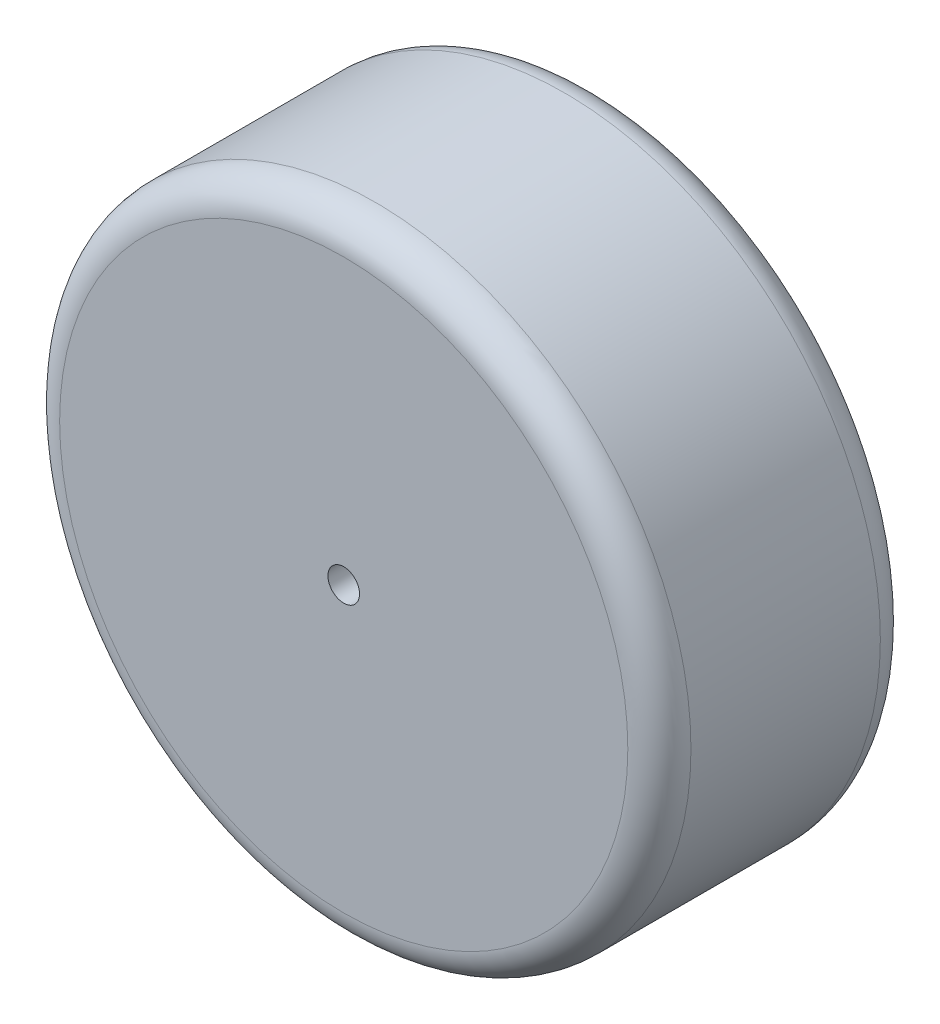
ISO-10303-21;
HEADER;
FILE_DESCRIPTION(('STEP AP214'),'2;1');
FILE_NAME('part.step','',(''),(''),'','','');
FILE_SCHEMA(('AUTOMOTIVE_DESIGN { 1 0 10303 214 1 1 1 1 }'));
ENDSEC;
DATA;
#1=APPLICATION_CONTEXT('core data for automotive mechanical design processes');
#2=APPLICATION_PROTOCOL_DEFINITION('international standard','automotive_design',2000,#1);
#3=PRODUCT_CONTEXT('',#1,'mechanical');
#4=PRODUCT('Part','Part','',(#3));
#5=PRODUCT_RELATED_PRODUCT_CATEGORY('part','',(#4));
#6=PRODUCT_DEFINITION_FORMATION('','',#4);
#7=PRODUCT_DEFINITION_CONTEXT('part definition',#1,'design');
#8=PRODUCT_DEFINITION('design','',#6,#7);
#9=PRODUCT_DEFINITION_SHAPE('','',#8);
#10=(LENGTH_UNIT() NAMED_UNIT(*) SI_UNIT(.MILLI.,.METRE.));
#11=(NAMED_UNIT(*) PLANE_ANGLE_UNIT() SI_UNIT($,.RADIAN.));
#12=(NAMED_UNIT(*) SI_UNIT($,.STERADIAN.) SOLID_ANGLE_UNIT());
#13=UNCERTAINTY_MEASURE_WITH_UNIT(LENGTH_MEASURE(1.E-05),#10,'distance_accuracy_value','');
#14=(GEOMETRIC_REPRESENTATION_CONTEXT(3) GLOBAL_UNCERTAINTY_ASSIGNED_CONTEXT((#13)) GLOBAL_UNIT_ASSIGNED_CONTEXT((#10,
#11,#12)) REPRESENTATION_CONTEXT('',''));
#15=CARTESIAN_POINT('',(0.,0.,0.));
#16=DIRECTION('',(0.,0.,1.));
#17=DIRECTION('',(1.,0.,0.));
#18=AXIS2_PLACEMENT_3D('',#15,#16,#17);
#19=CARTESIAN_POINT('',(0.,0.,80.));
#20=DIRECTION('',(0.,0.,1.));
#21=DIRECTION('',(1.,0.,0.));
#22=AXIS2_PLACEMENT_3D('',#19,#20,#21);
#23=PLANE('',#22);
#24=CARTESIAN_POINT('',(0.,0.,80.));
#25=DIRECTION('',(0.,0.,1.));
#26=DIRECTION('',(1.,0.,0.));
#27=AXIS2_PLACEMENT_3D('',#24,#25,#26);
#28=CIRCLE('',#27,90.);
#29=CARTESIAN_POINT('',(90.,0.,80.));
#30=VERTEX_POINT('',#29);
#31=EDGE_CURVE('E10',#30,#30,#28,.T.);
#32=ORIENTED_EDGE('',*,*,#31,.T.);
#33=EDGE_LOOP('',(#32));
#34=FACE_BOUND('',#33,.T.);
#35=CARTESIAN_POINT('',(0.,0.,80.));
#36=DIRECTION('',(0.,0.,1.));
#37=DIRECTION('',(1.,0.,0.));
#38=AXIS2_PLACEMENT_3D('',#35,#36,#37);
#39=CIRCLE('',#38,5.);
#40=CARTESIAN_POINT('',(5.,0.,80.));
#41=VERTEX_POINT('',#40);
#42=EDGE_CURVE('E56',#41,#41,#39,.T.);
#43=ORIENTED_EDGE('',*,*,#42,.F.);
#44=EDGE_LOOP('',(#43));
#45=FACE_BOUND('',#44,.T.);
#46=ADVANCED_FACE('F36',(#34,#45),#23,.T.);
#47=CARTESIAN_POINT('',(0.,0.,0.));
#48=DIRECTION('',(0.,0.,1.));
#49=DIRECTION('',(1.,0.,0.));
#50=AXIS2_PLACEMENT_3D('',#47,#48,#49);
#51=PLANE('',#50);
#52=CARTESIAN_POINT('',(0.,0.,0.));
#53=DIRECTION('',(0.,0.,1.));
#54=DIRECTION('',(1.,0.,0.));
#55=AXIS2_PLACEMENT_3D('',#52,#53,#54);
#56=CIRCLE('',#55,90.);
#57=CARTESIAN_POINT('',(90.,0.,0.));
#58=VERTEX_POINT('',#57);
#59=EDGE_CURVE('E43',#58,#58,#56,.F.);
#60=ORIENTED_EDGE('',*,*,#59,.T.);
#61=EDGE_LOOP('',(#60));
#62=FACE_BOUND('',#61,.T.);
#63=CARTESIAN_POINT('',(0.,0.,0.));
#64=DIRECTION('',(0.,0.,1.));
#65=DIRECTION('',(1.,0.,0.));
#66=AXIS2_PLACEMENT_3D('',#63,#64,#65);
#67=CIRCLE('',#66,5.);
#68=CARTESIAN_POINT('',(5.,0.,0.));
#69=VERTEX_POINT('',#68);
#70=EDGE_CURVE('E57',#69,#69,#67,.T.);
#71=ORIENTED_EDGE('',*,*,#70,.T.);
#72=EDGE_LOOP('',(#71));
#73=FACE_BOUND('',#72,.T.);
#74=ADVANCED_FACE('F67',(#62,#73),#51,.F.);
#75=CARTESIAN_POINT('',(0.,0.,80.));
#76=DIRECTION('',(0.,0.,-1.));
#77=DIRECTION('',(-1.,0.,0.));
#78=AXIS2_PLACEMENT_3D('',#75,#76,#77);
#79=CYLINDRICAL_SURFACE('',#78,100.);
#80=CARTESIAN_POINT('',(0.,0.,9.99999999999999));
#81=DIRECTION('',(0.,0.,1.));
#82=DIRECTION('',(1.,0.,0.));
#83=AXIS2_PLACEMENT_3D('',#80,#81,#82);
#84=CIRCLE('',#83,100.);
#85=CARTESIAN_POINT('',(100.,0.,9.99999999999999));
#86=VERTEX_POINT('',#85);
#87=EDGE_CURVE('E47',#86,#86,#84,.T.);
#88=ORIENTED_EDGE('',*,*,#87,.T.);
#89=EDGE_LOOP('',(#88));
#90=FACE_BOUND('',#89,.T.);
#91=CARTESIAN_POINT('',(0.,0.,70.));
#92=DIRECTION('',(0.,0.,1.));
#93=DIRECTION('',(1.,0.,0.));
#94=AXIS2_PLACEMENT_3D('',#91,#92,#93);
#95=CIRCLE('',#94,100.);
#96=CARTESIAN_POINT('',(100.,0.,70.));
#97=VERTEX_POINT('',#96);
#98=EDGE_CURVE('E51',#97,#97,#95,.F.);
#99=ORIENTED_EDGE('',*,*,#98,.T.);
#100=EDGE_LOOP('',(#99));
#101=FACE_BOUND('',#100,.T.);
#102=ADVANCED_FACE('F72',(#90,#101),#79,.T.);
#103=CARTESIAN_POINT('',(0.,0.,80.));
#104=DIRECTION('',(0.,0.,-1.));
#105=DIRECTION('',(-1.,0.,0.));
#106=AXIS2_PLACEMENT_3D('',#103,#104,#105);
#107=CYLINDRICAL_SURFACE('',#106,5.);
#108=ORIENTED_EDGE('',*,*,#42,.T.);
#109=EDGE_LOOP('',(#108));
#110=FACE_BOUND('',#109,.T.);
#111=ORIENTED_EDGE('',*,*,#70,.F.);
#112=EDGE_LOOP('',(#111));
#113=FACE_BOUND('',#112,.T.);
#114=ADVANCED_FACE('F63',(#110,#113),#107,.F.);
#115=CARTESIAN_POINT('',(0.,0.,9.99999999999999));
#116=DIRECTION('',(0.,0.,1.));
#117=DIRECTION('',(1.,0.,0.));
#118=AXIS2_PLACEMENT_3D('',#115,#116,#117);
#119=TOROIDAL_SURFACE('',#118,90.,10.);
#120=ORIENTED_EDGE('',*,*,#59,.F.);
#121=EDGE_LOOP('',(#120));
#122=FACE_BOUND('',#121,.T.);
#123=ORIENTED_EDGE('',*,*,#87,.F.);
#124=EDGE_LOOP('',(#123));
#125=FACE_BOUND('',#124,.T.);
#126=ADVANCED_FACE('F78',(#122,#125),#119,.T.);
#127=CARTESIAN_POINT('',(0.,0.,70.));
#128=DIRECTION('',(0.,0.,1.));
#129=DIRECTION('',(1.,0.,0.));
#130=AXIS2_PLACEMENT_3D('',#127,#128,#129);
#131=TOROIDAL_SURFACE('',#130,90.,10.);
#132=ORIENTED_EDGE('',*,*,#98,.F.);
#133=EDGE_LOOP('',(#132));
#134=FACE_BOUND('',#133,.T.);
#135=ORIENTED_EDGE('',*,*,#31,.F.);
#136=EDGE_LOOP('',(#135));
#137=FACE_BOUND('',#136,.T.);
#138=ADVANCED_FACE('F38',(#134,#137),#131,.T.);
#139=CLOSED_SHELL('',(#46,#74,#102,#114,#126,#138));
#140=MANIFOLD_SOLID_BREP('B2',#139);
#141=ADVANCED_BREP_SHAPE_REPRESENTATION('',(#18,#140),#14);
#142=SHAPE_DEFINITION_REPRESENTATION(#9,#141);
ENDSEC;
END-ISO-10303-21;
